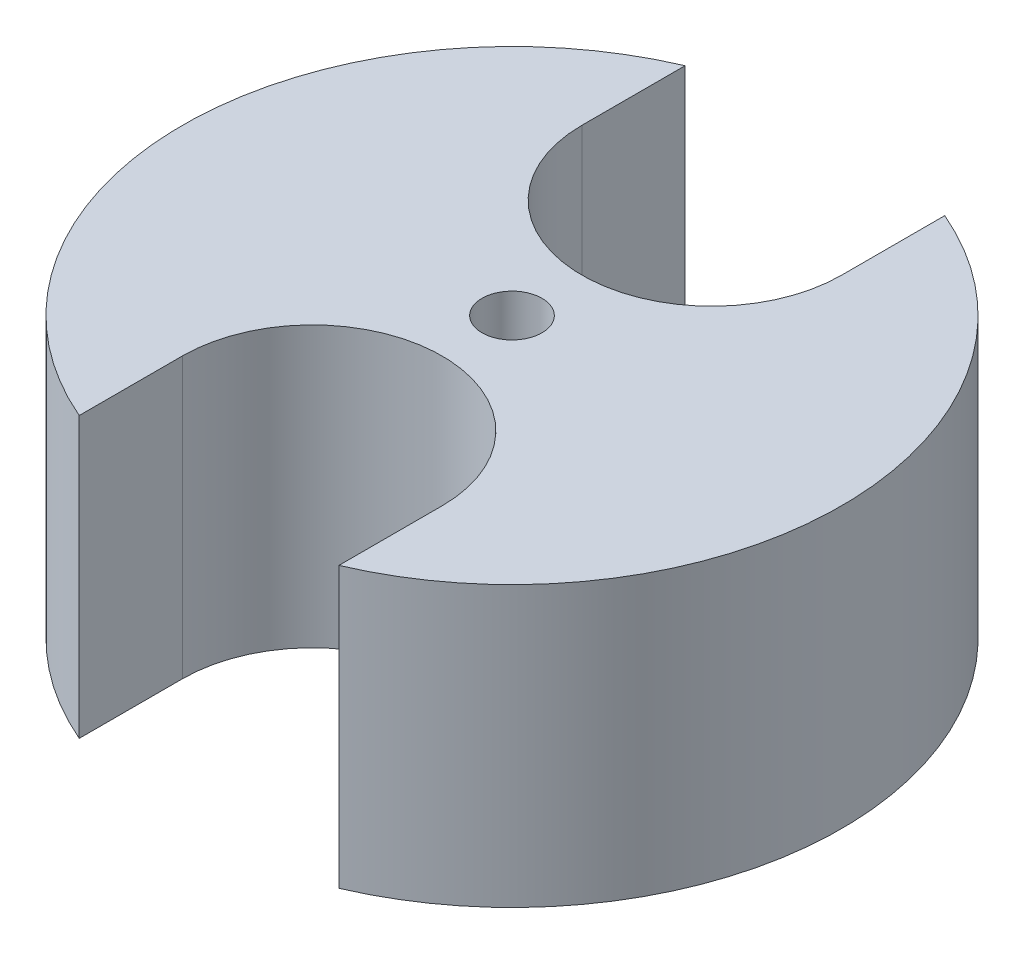
ISO-10303-21;
HEADER;
FILE_DESCRIPTION(('STEP AP214'),'2;1');
FILE_NAME('part.step','',(''),(''),'','','');
FILE_SCHEMA(('AUTOMOTIVE_DESIGN { 1 0 10303 214 1 1 1 1 }'));
ENDSEC;
DATA;
#1=APPLICATION_CONTEXT('core data for automotive mechanical design processes');
#2=APPLICATION_PROTOCOL_DEFINITION('international standard','automotive_design',2000,#1);
#3=PRODUCT_CONTEXT('',#1,'mechanical');
#4=PRODUCT('Part','Part','',(#3));
#5=PRODUCT_RELATED_PRODUCT_CATEGORY('part','',(#4));
#6=PRODUCT_DEFINITION_FORMATION('','',#4);
#7=PRODUCT_DEFINITION_CONTEXT('part definition',#1,'design');
#8=PRODUCT_DEFINITION('design','',#6,#7);
#9=PRODUCT_DEFINITION_SHAPE('','',#8);
#10=(LENGTH_UNIT() NAMED_UNIT(*) SI_UNIT(.MILLI.,.METRE.));
#11=(NAMED_UNIT(*) PLANE_ANGLE_UNIT() SI_UNIT($,.RADIAN.));
#12=(NAMED_UNIT(*) SI_UNIT($,.STERADIAN.) SOLID_ANGLE_UNIT());
#13=UNCERTAINTY_MEASURE_WITH_UNIT(LENGTH_MEASURE(1.E-05),#10,'distance_accuracy_value','');
#14=(GEOMETRIC_REPRESENTATION_CONTEXT(3) GLOBAL_UNCERTAINTY_ASSIGNED_CONTEXT((#13)) GLOBAL_UNIT_ASSIGNED_CONTEXT((#10,
#11,#12)) REPRESENTATION_CONTEXT('',''));
#15=CARTESIAN_POINT('',(0.,0.,0.));
#16=DIRECTION('',(0.,0.,1.));
#17=DIRECTION('',(1.,0.,0.));
#18=AXIS2_PLACEMENT_3D('',#15,#16,#17);
#19=CARTESIAN_POINT('',(0.,14.,10.0000000000001));
#20=DIRECTION('',(0.,-1.,0.));
#21=DIRECTION('',(0.,0.,-1.));
#22=AXIS2_PLACEMENT_3D('',#19,#20,#21);
#23=CYLINDRICAL_SURFACE('',#22,6.5);
#24=CARTESIAN_POINT('',(0.,0.,10.0000000000001));
#25=DIRECTION('',(0.,-1.,0.));
#26=DIRECTION('',(0.,0.,-1.));
#27=AXIS2_PLACEMENT_3D('',#24,#25,#26);
#28=CIRCLE('',#27,6.5);
#29=CARTESIAN_POINT('',(-6.49999999999993,0.,10.0000000000002));
#30=VERTEX_POINT('',#29);
#31=CARTESIAN_POINT('',(6.50000000000007,0.,10.0000000000001));
#32=VERTEX_POINT('',#31);
#33=EDGE_CURVE('E160',#30,#32,#28,.T.);
#34=ORIENTED_EDGE('',*,*,#33,.T.);
#35=DIRECTION('',(0.,-1.,0.));
#36=VECTOR('',#35,1.);
#37=CARTESIAN_POINT('',(6.50000000000007,14.,10.0000000000001));
#38=LINE('',#37,#36);
#39=CARTESIAN_POINT('',(6.50000000000007,14.,10.0000000000001));
#40=VERTEX_POINT('',#39);
#41=EDGE_CURVE('E48',#40,#32,#38,.T.);
#42=ORIENTED_EDGE('',*,*,#41,.F.);
#43=CARTESIAN_POINT('',(0.,14.,10.0000000000001));
#44=DIRECTION('',(0.,-1.,0.));
#45=DIRECTION('',(0.,0.,-1.));
#46=AXIS2_PLACEMENT_3D('',#43,#44,#45);
#47=CIRCLE('',#46,6.5);
#48=CARTESIAN_POINT('',(-6.49999999999993,14.,10.0000000000002));
#49=VERTEX_POINT('',#48);
#50=EDGE_CURVE('E184',#49,#40,#47,.T.);
#51=ORIENTED_EDGE('',*,*,#50,.F.);
#52=DIRECTION('',(0.,-1.,0.));
#53=VECTOR('',#52,1.);
#54=CARTESIAN_POINT('',(-6.49999999999993,14.,10.0000000000002));
#55=LINE('',#54,#53);
#56=EDGE_CURVE('E156',#49,#30,#55,.T.);
#57=ORIENTED_EDGE('',*,*,#56,.T.);
#58=EDGE_LOOP('',(#34,#42,#51,#57));
#59=FACE_BOUND('',#58,.T.);
#60=ADVANCED_FACE('F45',(#59),#23,.F.);
#61=CARTESIAN_POINT('',(6.50000000000007,14.,10.0000000000001));
#62=DIRECTION('',(1.,0.,0.));
#63=DIRECTION('',(0.,0.,-1.));
#64=AXIS2_PLACEMENT_3D('',#61,#62,#63);
#65=PLANE('',#64);
#66=DIRECTION('',(0.,0.,1.));
#67=VECTOR('',#66,1.);
#68=CARTESIAN_POINT('',(6.50000000000007,0.,10.0000000000001));
#69=LINE('',#68,#67);
#70=CARTESIAN_POINT('',(6.50000000000011,0.,15.1657508881032));
#71=VERTEX_POINT('',#70);
#72=EDGE_CURVE('E164',#32,#71,#69,.T.);
#73=ORIENTED_EDGE('',*,*,#72,.T.);
#74=DIRECTION('',(0.,-1.,0.));
#75=VECTOR('',#74,1.);
#76=CARTESIAN_POINT('',(6.50000000000011,14.,15.1657508881032));
#77=LINE('',#76,#75);
#78=CARTESIAN_POINT('',(6.50000000000011,14.,15.1657508881032));
#79=VERTEX_POINT('',#78);
#80=EDGE_CURVE('E198',#79,#71,#77,.T.);
#81=ORIENTED_EDGE('',*,*,#80,.F.);
#82=DIRECTION('',(0.,0.,1.));
#83=VECTOR('',#82,1.);
#84=CARTESIAN_POINT('',(6.50000000000007,14.,10.0000000000001));
#85=LINE('',#84,#83);
#86=EDGE_CURVE('E112',#40,#79,#85,.T.);
#87=ORIENTED_EDGE('',*,*,#86,.F.);
#88=ORIENTED_EDGE('',*,*,#41,.T.);
#89=EDGE_LOOP('',(#73,#81,#87,#88));
#90=FACE_BOUND('',#89,.T.);
#91=ADVANCED_FACE('F206',(#90),#65,.F.);
#92=CARTESIAN_POINT('',(0.,14.,0.));
#93=DIRECTION('',(0.,-1.,0.));
#94=DIRECTION('',(0.,0.,-1.));
#95=AXIS2_PLACEMENT_3D('',#92,#93,#94);
#96=CYLINDRICAL_SURFACE('',#95,16.5000000000001);
#97=CARTESIAN_POINT('',(0.,0.,0.));
#98=DIRECTION('',(0.,1.,0.));
#99=DIRECTION('',(0.,0.,1.));
#100=AXIS2_PLACEMENT_3D('',#97,#98,#99);
#101=CIRCLE('',#100,16.5000000000001);
#102=CARTESIAN_POINT('',(6.50000000000002,0.,-15.1657508881031));
#103=VERTEX_POINT('',#102);
#104=EDGE_CURVE('E168',#71,#103,#101,.T.);
#105=ORIENTED_EDGE('',*,*,#104,.T.);
#106=DIRECTION('',(0.,-1.,0.));
#107=VECTOR('',#106,1.);
#108=CARTESIAN_POINT('',(6.50000000000002,14.,-15.1657508881031));
#109=LINE('',#108,#107);
#110=CARTESIAN_POINT('',(6.50000000000002,14.,-15.1657508881031));
#111=VERTEX_POINT('',#110);
#112=EDGE_CURVE('E195',#111,#103,#109,.T.);
#113=ORIENTED_EDGE('',*,*,#112,.F.);
#114=CARTESIAN_POINT('',(0.,14.,0.));
#115=DIRECTION('',(0.,1.,0.));
#116=DIRECTION('',(0.,0.,1.));
#117=AXIS2_PLACEMENT_3D('',#114,#115,#116);
#118=CIRCLE('',#117,16.5000000000001);
#119=EDGE_CURVE('E222',#79,#111,#118,.T.);
#120=ORIENTED_EDGE('',*,*,#119,.F.);
#121=ORIENTED_EDGE('',*,*,#80,.T.);
#122=EDGE_LOOP('',(#105,#113,#120,#121));
#123=FACE_BOUND('',#122,.T.);
#124=ADVANCED_FACE('F215',(#123),#96,.T.);
#125=CARTESIAN_POINT('',(6.5,14.,-10.));
#126=DIRECTION('',(1.,0.,0.));
#127=DIRECTION('',(0.,0.,-1.));
#128=AXIS2_PLACEMENT_3D('',#125,#126,#127);
#129=PLANE('',#128);
#130=DIRECTION('',(0.,0.,1.));
#131=VECTOR('',#130,1.);
#132=CARTESIAN_POINT('',(6.5,0.,-10.));
#133=LINE('',#132,#131);
#134=CARTESIAN_POINT('',(6.5,0.,-10.));
#135=VERTEX_POINT('',#134);
#136=EDGE_CURVE('E171',#103,#135,#133,.T.);
#137=ORIENTED_EDGE('',*,*,#136,.T.);
#138=DIRECTION('',(0.,-1.,0.));
#139=VECTOR('',#138,1.);
#140=CARTESIAN_POINT('',(6.5,14.,-10.));
#141=LINE('',#140,#139);
#142=CARTESIAN_POINT('',(6.5,14.,-10.));
#143=VERTEX_POINT('',#142);
#144=EDGE_CURVE('E191',#143,#135,#141,.T.);
#145=ORIENTED_EDGE('',*,*,#144,.F.);
#146=DIRECTION('',(0.,0.,1.));
#147=VECTOR('',#146,1.);
#148=CARTESIAN_POINT('',(6.5,14.,-10.));
#149=LINE('',#148,#147);
#150=EDGE_CURVE('E220',#111,#143,#149,.T.);
#151=ORIENTED_EDGE('',*,*,#150,.F.);
#152=ORIENTED_EDGE('',*,*,#112,.T.);
#153=EDGE_LOOP('',(#137,#145,#151,#152));
#154=FACE_BOUND('',#153,.T.);
#155=ADVANCED_FACE('F218',(#154),#129,.F.);
#156=CARTESIAN_POINT('',(0.,14.,-10.));
#157=DIRECTION('',(0.,-1.,0.));
#158=DIRECTION('',(0.,0.,-1.));
#159=AXIS2_PLACEMENT_3D('',#156,#157,#158);
#160=CYLINDRICAL_SURFACE('',#159,6.5);
#161=CARTESIAN_POINT('',(0.,0.,-10.));
#162=DIRECTION('',(0.,-1.,0.));
#163=DIRECTION('',(0.,0.,1.));
#164=AXIS2_PLACEMENT_3D('',#161,#162,#163);
#165=CIRCLE('',#164,6.5);
#166=CARTESIAN_POINT('',(-6.5,0.,-10.));
#167=VERTEX_POINT('',#166);
#168=EDGE_CURVE('E174',#135,#167,#165,.T.);
#169=ORIENTED_EDGE('',*,*,#168,.T.);
#170=DIRECTION('',(0.,-1.,0.));
#171=VECTOR('',#170,1.);
#172=CARTESIAN_POINT('',(-6.5,14.,-10.));
#173=LINE('',#172,#171);
#174=CARTESIAN_POINT('',(-6.5,14.,-10.));
#175=VERTEX_POINT('',#174);
#176=EDGE_CURVE('E149',#175,#167,#173,.T.);
#177=ORIENTED_EDGE('',*,*,#176,.F.);
#178=CARTESIAN_POINT('',(0.,14.,-10.));
#179=DIRECTION('',(0.,-1.,0.));
#180=DIRECTION('',(0.,0.,1.));
#181=AXIS2_PLACEMENT_3D('',#178,#179,#180);
#182=CIRCLE('',#181,6.5);
#183=EDGE_CURVE('E135',#143,#175,#182,.T.);
#184=ORIENTED_EDGE('',*,*,#183,.F.);
#185=ORIENTED_EDGE('',*,*,#144,.T.);
#186=EDGE_LOOP('',(#169,#177,#184,#185));
#187=FACE_BOUND('',#186,.T.);
#188=ADVANCED_FACE('F297',(#187),#160,.F.);
#189=CARTESIAN_POINT('',(-6.5,14.,-15.1657508881031));
#190=DIRECTION('',(-1.,0.,0.));
#191=DIRECTION('',(0.,0.,1.));
#192=AXIS2_PLACEMENT_3D('',#189,#190,#191);
#193=PLANE('',#192);
#194=DIRECTION('',(0.,0.,-1.));
#195=VECTOR('',#194,1.);
#196=CARTESIAN_POINT('',(-6.5,0.,-15.1657508881031));
#197=LINE('',#196,#195);
#198=CARTESIAN_POINT('',(-6.5,0.,-15.1657508881031));
#199=VERTEX_POINT('',#198);
#200=EDGE_CURVE('E145',#167,#199,#197,.T.);
#201=ORIENTED_EDGE('',*,*,#200,.T.);
#202=DIRECTION('',(0.,-1.,0.));
#203=VECTOR('',#202,1.);
#204=CARTESIAN_POINT('',(-6.5,14.,-15.1657508881031));
#205=LINE('',#204,#203);
#206=CARTESIAN_POINT('',(-6.5,14.,-15.1657508881031));
#207=VERTEX_POINT('',#206);
#208=EDGE_CURVE('E142',#207,#199,#205,.T.);
#209=ORIENTED_EDGE('',*,*,#208,.F.);
#210=DIRECTION('',(0.,0.,-1.));
#211=VECTOR('',#210,1.);
#212=CARTESIAN_POINT('',(-6.5,14.,-15.1657508881031));
#213=LINE('',#212,#211);
#214=EDGE_CURVE('E128',#175,#207,#213,.T.);
#215=ORIENTED_EDGE('',*,*,#214,.F.);
#216=ORIENTED_EDGE('',*,*,#176,.T.);
#217=EDGE_LOOP('',(#201,#209,#215,#216));
#218=FACE_BOUND('',#217,.T.);
#219=ADVANCED_FACE('F143',(#218),#193,.F.);
#220=CARTESIAN_POINT('',(0.,14.,0.));
#221=DIRECTION('',(0.,-1.,0.));
#222=DIRECTION('',(0.,0.,-1.));
#223=AXIS2_PLACEMENT_3D('',#220,#221,#222);
#224=CYLINDRICAL_SURFACE('',#223,16.5000000000001);
#225=CARTESIAN_POINT('',(0.,0.,0.));
#226=DIRECTION('',(0.,1.,0.));
#227=DIRECTION('',(0.,0.,1.));
#228=AXIS2_PLACEMENT_3D('',#225,#226,#227);
#229=CIRCLE('',#228,16.5000000000001);
#230=CARTESIAN_POINT('',(-6.49999999999987,0.,15.1657508881032));
#231=VERTEX_POINT('',#230);
#232=EDGE_CURVE('E179',#199,#231,#229,.T.);
#233=ORIENTED_EDGE('',*,*,#232,.T.);
#234=DIRECTION('',(0.,-1.,0.));
#235=VECTOR('',#234,1.);
#236=CARTESIAN_POINT('',(-6.49999999999987,14.,15.1657508881032));
#237=LINE('',#236,#235);
#238=CARTESIAN_POINT('',(-6.49999999999987,14.,15.1657508881032));
#239=VERTEX_POINT('',#238);
#240=EDGE_CURVE('E150',#239,#231,#237,.T.);
#241=ORIENTED_EDGE('',*,*,#240,.F.);
#242=CARTESIAN_POINT('',(0.,14.,0.));
#243=DIRECTION('',(0.,1.,0.));
#244=DIRECTION('',(0.,0.,1.));
#245=AXIS2_PLACEMENT_3D('',#242,#243,#244);
#246=CIRCLE('',#245,16.5000000000001);
#247=EDGE_CURVE('E132',#207,#239,#246,.T.);
#248=ORIENTED_EDGE('',*,*,#247,.F.);
#249=ORIENTED_EDGE('',*,*,#208,.T.);
#250=EDGE_LOOP('',(#233,#241,#248,#249));
#251=FACE_BOUND('',#250,.T.);
#252=ADVANCED_FACE('F152',(#251),#224,.T.);
#253=CARTESIAN_POINT('',(-6.4999999999999,14.,15.1657508881033));
#254=DIRECTION('',(-1.,0.,0.));
#255=DIRECTION('',(0.,0.,1.));
#256=AXIS2_PLACEMENT_3D('',#253,#254,#255);
#257=PLANE('',#256);
#258=DIRECTION('',(0.,0.,-1.));
#259=VECTOR('',#258,1.);
#260=CARTESIAN_POINT('',(-6.4999999999999,0.,15.1657508881033));
#261=LINE('',#260,#259);
#262=EDGE_CURVE('E103',#231,#30,#261,.T.);
#263=ORIENTED_EDGE('',*,*,#262,.T.);
#264=ORIENTED_EDGE('',*,*,#56,.F.);
#265=DIRECTION('',(0.,0.,-1.));
#266=VECTOR('',#265,1.);
#267=CARTESIAN_POINT('',(-6.4999999999999,14.,15.1657508881033));
#268=LINE('',#267,#266);
#269=EDGE_CURVE('E70',#239,#49,#268,.T.);
#270=ORIENTED_EDGE('',*,*,#269,.F.);
#271=ORIENTED_EDGE('',*,*,#240,.T.);
#272=EDGE_LOOP('',(#263,#264,#270,#271));
#273=FACE_BOUND('',#272,.T.);
#274=ADVANCED_FACE('F274',(#273),#257,.F.);
#275=CARTESIAN_POINT('',(0.,14.,10.0000000000001));
#276=DIRECTION('',(0.,-1.,0.));
#277=DIRECTION('',(0.,0.,-1.));
#278=AXIS2_PLACEMENT_3D('',#275,#276,#277);
#279=PLANE('',#278);
#280=CARTESIAN_POINT('',(0.,14.,0.));
#281=DIRECTION('',(0.,1.,0.));
#282=DIRECTION('',(0.,0.,1.));
#283=AXIS2_PLACEMENT_3D('',#280,#281,#282);
#284=CIRCLE('',#283,1.5);
#285=CARTESIAN_POINT('',(0.,14.,1.5));
#286=VERTEX_POINT('',#285);
#287=EDGE_CURVE('E256',#286,#286,#284,.T.);
#288=ORIENTED_EDGE('',*,*,#287,.F.);
#289=EDGE_LOOP('',(#288));
#290=FACE_BOUND('',#289,.T.);
#291=ORIENTED_EDGE('',*,*,#50,.T.);
#292=ORIENTED_EDGE('',*,*,#86,.T.);
#293=ORIENTED_EDGE('',*,*,#119,.T.);
#294=ORIENTED_EDGE('',*,*,#150,.T.);
#295=ORIENTED_EDGE('',*,*,#183,.T.);
#296=ORIENTED_EDGE('',*,*,#214,.T.);
#297=ORIENTED_EDGE('',*,*,#247,.T.);
#298=ORIENTED_EDGE('',*,*,#269,.T.);
#299=EDGE_LOOP('',(#291,#292,#293,#294,#295,#296,#297,#298));
#300=FACE_BOUND('',#299,.T.);
#301=ADVANCED_FACE('F130',(#290,#300),#279,.F.);
#302=CARTESIAN_POINT('',(0.,0.,10.0000000000001));
#303=DIRECTION('',(0.,-1.,0.));
#304=DIRECTION('',(0.,0.,-1.));
#305=AXIS2_PLACEMENT_3D('',#302,#303,#304);
#306=PLANE('',#305);
#307=CARTESIAN_POINT('',(0.,0.,0.));
#308=DIRECTION('',(0.,-1.,0.));
#309=DIRECTION('',(0.,0.,-1.));
#310=AXIS2_PLACEMENT_3D('',#307,#308,#309);
#311=CIRCLE('',#310,3.);
#312=CARTESIAN_POINT('',(0.,0.,-3.));
#313=VERTEX_POINT('',#312);
#314=EDGE_CURVE('E11',#313,#313,#311,.T.);
#315=ORIENTED_EDGE('',*,*,#314,.F.);
#316=EDGE_LOOP('',(#315));
#317=FACE_BOUND('',#316,.T.);
#318=ORIENTED_EDGE('',*,*,#33,.F.);
#319=ORIENTED_EDGE('',*,*,#262,.F.);
#320=ORIENTED_EDGE('',*,*,#232,.F.);
#321=ORIENTED_EDGE('',*,*,#200,.F.);
#322=ORIENTED_EDGE('',*,*,#168,.F.);
#323=ORIENTED_EDGE('',*,*,#136,.F.);
#324=ORIENTED_EDGE('',*,*,#104,.F.);
#325=ORIENTED_EDGE('',*,*,#72,.F.);
#326=EDGE_LOOP('',(#318,#319,#320,#321,#322,#323,#324,#325));
#327=FACE_BOUND('',#326,.T.);
#328=ADVANCED_FACE('F211',(#317,#327),#306,.T.);
#329=CARTESIAN_POINT('',(0.,-3.,0.));
#330=DIRECTION('',(0.,1.,0.));
#331=DIRECTION('',(0.,0.,1.));
#332=AXIS2_PLACEMENT_3D('',#329,#330,#331);
#333=CYLINDRICAL_SURFACE('',#332,3.);
#334=CARTESIAN_POINT('',(0.,-3.,0.));
#335=DIRECTION('',(0.,-1.,0.));
#336=DIRECTION('',(0.,0.,-1.));
#337=AXIS2_PLACEMENT_3D('',#334,#335,#336);
#338=CIRCLE('',#337,3.);
#339=CARTESIAN_POINT('',(0.,-3.,-3.));
#340=VERTEX_POINT('',#339);
#341=EDGE_CURVE('E165',#340,#340,#338,.T.);
#342=ORIENTED_EDGE('',*,*,#341,.F.);
#343=EDGE_LOOP('',(#342));
#344=FACE_BOUND('',#343,.T.);
#345=ORIENTED_EDGE('',*,*,#314,.T.);
#346=EDGE_LOOP('',(#345));
#347=FACE_BOUND('',#346,.T.);
#348=ADVANCED_FACE('F280',(#344,#347),#333,.T.);
#349=CARTESIAN_POINT('',(0.,-3.,0.));
#350=DIRECTION('',(0.,-1.,0.));
#351=DIRECTION('',(0.,0.,-1.));
#352=AXIS2_PLACEMENT_3D('',#349,#350,#351);
#353=PLANE('',#352);
#354=CARTESIAN_POINT('',(0.,-3.,0.));
#355=DIRECTION('',(0.,-1.,0.));
#356=DIRECTION('',(0.,0.,-1.));
#357=AXIS2_PLACEMENT_3D('',#354,#355,#356);
#358=CIRCLE('',#357,1.5);
#359=CARTESIAN_POINT('',(0.997797574661314,-3.,1.12));
#360=VERTEX_POINT('',#359);
#361=CARTESIAN_POINT('',(0.997797574661314,-3.,-1.12));
#362=VERTEX_POINT('',#361);
#363=EDGE_CURVE('E61',#360,#362,#358,.T.);
#364=ORIENTED_EDGE('',*,*,#363,.F.);
#365=DIRECTION('',(0.,0.,1.));
#366=VECTOR('',#365,1.);
#367=CARTESIAN_POINT('',(0.997797574661314,-3.,1.12));
#368=LINE('',#367,#366);
#369=EDGE_CURVE('E242',#362,#360,#368,.T.);
#370=ORIENTED_EDGE('',*,*,#369,.F.);
#371=EDGE_LOOP('',(#364,#370));
#372=FACE_BOUND('',#371,.T.);
#373=ORIENTED_EDGE('',*,*,#341,.T.);
#374=EDGE_LOOP('',(#373));
#375=FACE_BOUND('',#374,.T.);
#376=ADVANCED_FACE('F325',(#372,#375),#353,.T.);
#377=CARTESIAN_POINT('',(0.,5.,0.));
#378=DIRECTION('',(0.,-1.,0.));
#379=DIRECTION('',(0.,0.,-1.));
#380=AXIS2_PLACEMENT_3D('',#377,#378,#379);
#381=CYLINDRICAL_SURFACE('',#380,1.5);
#382=ORIENTED_EDGE('',*,*,#363,.T.);
#383=DIRECTION('',(0.,-1.,0.));
#384=VECTOR('',#383,1.);
#385=CARTESIAN_POINT('',(0.997797574661314,5.,-1.12));
#386=LINE('',#385,#384);
#387=CARTESIAN_POINT('',(0.997797574661314,5.,-1.12));
#388=VERTEX_POINT('',#387);
#389=EDGE_CURVE('E236',#388,#362,#386,.T.);
#390=ORIENTED_EDGE('',*,*,#389,.F.);
#391=CARTESIAN_POINT('',(0.,5.,0.));
#392=DIRECTION('',(0.,-1.,0.));
#393=DIRECTION('',(0.,0.,-1.));
#394=AXIS2_PLACEMENT_3D('',#391,#392,#393);
#395=CIRCLE('',#394,1.5);
#396=CARTESIAN_POINT('',(0.997797574661314,5.,1.12));
#397=VERTEX_POINT('',#396);
#398=EDGE_CURVE('E246',#397,#388,#395,.T.);
#399=ORIENTED_EDGE('',*,*,#398,.F.);
#400=DIRECTION('',(0.,-1.,0.));
#401=VECTOR('',#400,1.);
#402=CARTESIAN_POINT('',(0.997797574661314,5.,1.12));
#403=LINE('',#402,#401);
#404=EDGE_CURVE('E235',#397,#360,#403,.T.);
#405=ORIENTED_EDGE('',*,*,#404,.T.);
#406=EDGE_LOOP('',(#382,#390,#399,#405));
#407=FACE_BOUND('',#406,.T.);
#408=ADVANCED_FACE('F333',(#407),#381,.F.);
#409=CARTESIAN_POINT('',(0.997797574661314,5.,1.12));
#410=DIRECTION('',(1.,0.,0.));
#411=DIRECTION('',(0.,0.,-1.));
#412=AXIS2_PLACEMENT_3D('',#409,#410,#411);
#413=PLANE('',#412);
#414=ORIENTED_EDGE('',*,*,#369,.T.);
#415=ORIENTED_EDGE('',*,*,#404,.F.);
#416=DIRECTION('',(0.,0.,1.));
#417=VECTOR('',#416,1.);
#418=CARTESIAN_POINT('',(0.997797574661314,5.,1.12));
#419=LINE('',#418,#417);
#420=EDGE_CURVE('E239',#388,#397,#419,.T.);
#421=ORIENTED_EDGE('',*,*,#420,.F.);
#422=ORIENTED_EDGE('',*,*,#389,.T.);
#423=EDGE_LOOP('',(#414,#415,#421,#422));
#424=FACE_BOUND('',#423,.T.);
#425=ADVANCED_FACE('F342',(#424),#413,.F.);
#426=CARTESIAN_POINT('',(0.,5.,0.));
#427=DIRECTION('',(0.,-1.,0.));
#428=DIRECTION('',(0.,0.,-1.));
#429=AXIS2_PLACEMENT_3D('',#426,#427,#428);
#430=PLANE('',#429);
#431=ORIENTED_EDGE('',*,*,#398,.T.);
#432=ORIENTED_EDGE('',*,*,#420,.T.);
#433=EDGE_LOOP('',(#431,#432));
#434=FACE_BOUND('',#433,.T.);
#435=ADVANCED_FACE('F269',(#434),#430,.T.);
#436=CARTESIAN_POINT('',(0.,8.,0.));
#437=DIRECTION('',(0.,1.,0.));
#438=DIRECTION('',(0.,0.,1.));
#439=AXIS2_PLACEMENT_3D('',#436,#437,#438);
#440=CYLINDRICAL_SURFACE('',#439,1.5);
#441=CARTESIAN_POINT('',(0.,8.,0.));
#442=DIRECTION('',(0.,1.,0.));
#443=DIRECTION('',(0.,0.,1.));
#444=AXIS2_PLACEMENT_3D('',#441,#442,#443);
#445=CIRCLE('',#444,1.5);
#446=CARTESIAN_POINT('',(0.,8.,1.5));
#447=VERTEX_POINT('',#446);
#448=EDGE_CURVE('E249',#447,#447,#445,.T.);
#449=ORIENTED_EDGE('',*,*,#448,.F.);
#450=EDGE_LOOP('',(#449));
#451=FACE_BOUND('',#450,.T.);
#452=ORIENTED_EDGE('',*,*,#287,.T.);
#453=EDGE_LOOP('',(#452));
#454=FACE_BOUND('',#453,.T.);
#455=ADVANCED_FACE('F266',(#451,#454),#440,.F.);
#456=CARTESIAN_POINT('',(0.,8.,0.));
#457=DIRECTION('',(0.,1.,0.));
#458=DIRECTION('',(0.,0.,1.));
#459=AXIS2_PLACEMENT_3D('',#456,#457,#458);
#460=PLANE('',#459);
#461=ORIENTED_EDGE('',*,*,#448,.T.);
#462=EDGE_LOOP('',(#461));
#463=FACE_BOUND('',#462,.T.);
#464=ADVANCED_FACE('F264',(#463),#460,.T.);
#465=CLOSED_SHELL('',(#60,#91,#124,#155,#188,#219,#252,#274,#301,#328,#348,#376,#408,#425,#435,
#455,#464));
#466=MANIFOLD_SOLID_BREP('B2',#465);
#467=ADVANCED_BREP_SHAPE_REPRESENTATION('',(#18,#466),#14);
#468=SHAPE_DEFINITION_REPRESENTATION(#9,#467);
ENDSEC;
END-ISO-10303-21;
